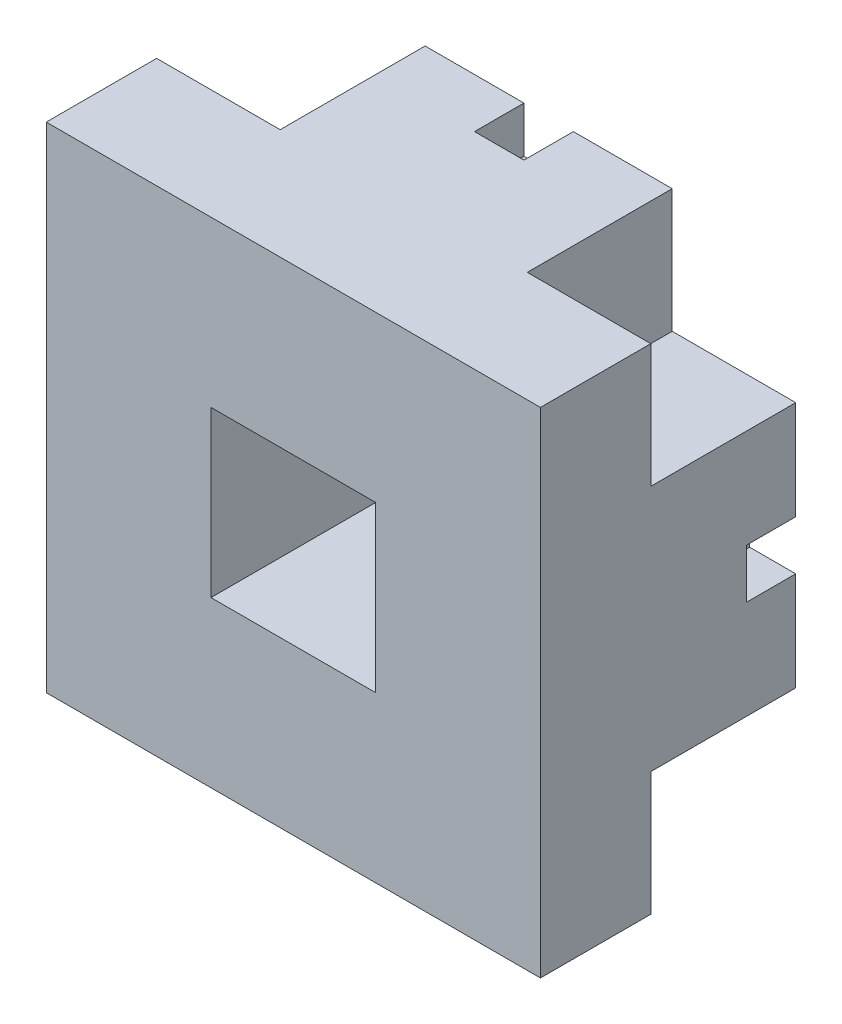
ISO-10303-21;
HEADER;
FILE_DESCRIPTION(('STEP AP214'),'2;1');
FILE_NAME('part.step','',(''),(''),'','','');
FILE_SCHEMA(('AUTOMOTIVE_DESIGN { 1 0 10303 214 1 1 1 1 }'));
ENDSEC;
DATA;
#1=APPLICATION_CONTEXT('core data for automotive mechanical design processes');
#2=APPLICATION_PROTOCOL_DEFINITION('international standard','automotive_design',2000,#1);
#3=PRODUCT_CONTEXT('',#1,'mechanical');
#4=PRODUCT('Part','Part','',(#3));
#5=PRODUCT_RELATED_PRODUCT_CATEGORY('part','',(#4));
#6=PRODUCT_DEFINITION_FORMATION('','',#4);
#7=PRODUCT_DEFINITION_CONTEXT('part definition',#1,'design');
#8=PRODUCT_DEFINITION('design','',#6,#7);
#9=PRODUCT_DEFINITION_SHAPE('','',#8);
#10=(LENGTH_UNIT() NAMED_UNIT(*) SI_UNIT(.MILLI.,.METRE.));
#11=(NAMED_UNIT(*) PLANE_ANGLE_UNIT() SI_UNIT($,.RADIAN.));
#12=(NAMED_UNIT(*) SI_UNIT($,.STERADIAN.) SOLID_ANGLE_UNIT());
#13=UNCERTAINTY_MEASURE_WITH_UNIT(LENGTH_MEASURE(1.E-05),#10,'distance_accuracy_value','');
#14=(GEOMETRIC_REPRESENTATION_CONTEXT(3) GLOBAL_UNCERTAINTY_ASSIGNED_CONTEXT((#13)) GLOBAL_UNIT_ASSIGNED_CONTEXT((#10,
#11,#12)) REPRESENTATION_CONTEXT('',''));
#15=CARTESIAN_POINT('',(0.,0.,0.));
#16=DIRECTION('',(0.,0.,1.));
#17=DIRECTION('',(1.,0.,0.));
#18=AXIS2_PLACEMENT_3D('',#15,#16,#17);
#19=CARTESIAN_POINT('',(0.,0.,0.));
#20=DIRECTION('',(0.,0.,1.));
#21=DIRECTION('',(1.,0.,0.));
#22=AXIS2_PLACEMENT_3D('',#19,#20,#21);
#23=PLANE('',#22);
#24=DIRECTION('',(0.,1.,0.));
#25=VECTOR('',#24,1.);
#26=CARTESIAN_POINT('',(-500.,-250.,0.));
#27=LINE('',#26,#25);
#28=CARTESIAN_POINT('',(-500.,-500.,0.));
#29=VERTEX_POINT('',#28);
#30=CARTESIAN_POINT('',(-500.,500.,0.));
#31=VERTEX_POINT('',#30);
#32=EDGE_CURVE('E666',#29,#31,#27,.T.);
#33=ORIENTED_EDGE('',*,*,#32,.T.);
#34=DIRECTION('',(1.,0.,0.));
#35=VECTOR('',#34,1.);
#36=CARTESIAN_POINT('',(-250.,500.,0.));
#37=LINE('',#36,#35);
#38=CARTESIAN_POINT('',(500.,500.,0.));
#39=VERTEX_POINT('',#38);
#40=EDGE_CURVE('E27',#31,#39,#37,.T.);
#41=ORIENTED_EDGE('',*,*,#40,.T.);
#42=DIRECTION('',(0.,-1.,0.));
#43=VECTOR('',#42,1.);
#44=CARTESIAN_POINT('',(500.,250.,0.));
#45=LINE('',#44,#43);
#46=CARTESIAN_POINT('',(500.,-500.,0.));
#47=VERTEX_POINT('',#46);
#48=EDGE_CURVE('E557',#39,#47,#45,.T.);
#49=ORIENTED_EDGE('',*,*,#48,.T.);
#50=DIRECTION('',(-1.,0.,0.));
#51=VECTOR('',#50,1.);
#52=CARTESIAN_POINT('',(250.,-500.,0.));
#53=LINE('',#52,#51);
#54=EDGE_CURVE('E515',#47,#29,#53,.T.);
#55=ORIENTED_EDGE('',*,*,#54,.T.);
#56=EDGE_LOOP('',(#33,#41,#49,#55));
#57=FACE_BOUND('',#56,.T.);
#58=DIRECTION('',(1.,0.,0.));
#59=VECTOR('',#58,1.);
#60=CARTESIAN_POINT('',(-1500.,1500.,0.));
#61=LINE('',#60,#59);
#62=CARTESIAN_POINT('',(-1500.,1500.,0.));
#63=VERTEX_POINT('',#62);
#64=CARTESIAN_POINT('',(1500.,1500.,0.));
#65=VERTEX_POINT('',#64);
#66=EDGE_CURVE('E586',#63,#65,#61,.T.);
#67=ORIENTED_EDGE('',*,*,#66,.F.);
#68=DIRECTION('',(0.,1.,0.));
#69=VECTOR('',#68,1.);
#70=CARTESIAN_POINT('',(-1500.,-1500.,0.));
#71=LINE('',#70,#69);
#72=CARTESIAN_POINT('',(-1500.,-1500.,0.));
#73=VERTEX_POINT('',#72);
#74=EDGE_CURVE('E641',#73,#63,#71,.T.);
#75=ORIENTED_EDGE('',*,*,#74,.F.);
#76=DIRECTION('',(-1.,0.,0.));
#77=VECTOR('',#76,1.);
#78=CARTESIAN_POINT('',(1500.,-1500.,0.));
#79=LINE('',#78,#77);
#80=CARTESIAN_POINT('',(1500.,-1500.,0.));
#81=VERTEX_POINT('',#80);
#82=EDGE_CURVE('E560',#81,#73,#79,.T.);
#83=ORIENTED_EDGE('',*,*,#82,.F.);
#84=DIRECTION('',(0.,-1.,0.));
#85=VECTOR('',#84,1.);
#86=CARTESIAN_POINT('',(1500.,1500.,0.));
#87=LINE('',#86,#85);
#88=EDGE_CURVE('E11',#65,#81,#87,.T.);
#89=ORIENTED_EDGE('',*,*,#88,.F.);
#90=EDGE_LOOP('',(#67,#75,#83,#89));
#91=FACE_BOUND('',#90,.T.);
#92=ADVANCED_FACE('F16',(#57,#91),#23,.T.);
#93=CARTESIAN_POINT('',(1500.,1500.,0.));
#94=DIRECTION('',(1.,0.,0.));
#95=DIRECTION('',(0.,1.,0.));
#96=AXIS2_PLACEMENT_3D('',#93,#94,#95);
#97=PLANE('',#96);
#98=DIRECTION('',(0.,0.,-1.));
#99=VECTOR('',#98,1.);
#100=CARTESIAN_POINT('',(1500.,150.,-775.));
#101=LINE('',#100,#99);
#102=CARTESIAN_POINT('',(1500.,150.,-1250.));
#103=VERTEX_POINT('',#102);
#104=CARTESIAN_POINT('',(1500.,150.,-1550.));
#105=VERTEX_POINT('',#104);
#106=EDGE_CURVE('E539',#103,#105,#101,.T.);
#107=ORIENTED_EDGE('',*,*,#106,.T.);
#108=DIRECTION('',(0.,-1.,0.));
#109=VECTOR('',#108,1.);
#110=CARTESIAN_POINT('',(1500.,1500.,-1550.));
#111=LINE('',#110,#109);
#112=CARTESIAN_POINT('',(1500.,750.,-1550.));
#113=VERTEX_POINT('',#112);
#114=EDGE_CURVE('E573',#113,#105,#111,.T.);
#115=ORIENTED_EDGE('',*,*,#114,.F.);
#116=DIRECTION('',(0.,0.,1.));
#117=VECTOR('',#116,1.);
#118=CARTESIAN_POINT('',(1500.,750.,-775.));
#119=LINE('',#118,#117);
#120=CARTESIAN_POINT('',(1500.,750.,-670.));
#121=VERTEX_POINT('',#120);
#122=EDGE_CURVE('E504',#113,#121,#119,.T.);
#123=ORIENTED_EDGE('',*,*,#122,.T.);
#124=DIRECTION('',(0.,1.,0.));
#125=VECTOR('',#124,1.);
#126=CARTESIAN_POINT('',(1500.,1312.5,-670.));
#127=LINE('',#126,#125);
#128=CARTESIAN_POINT('',(1500.,1500.,-670.));
#129=VERTEX_POINT('',#128);
#130=EDGE_CURVE('E445',#121,#129,#127,.T.);
#131=ORIENTED_EDGE('',*,*,#130,.T.);
#132=DIRECTION('',(0.,0.,-1.));
#133=VECTOR('',#132,1.);
#134=CARTESIAN_POINT('',(1500.,1500.,0.));
#135=LINE('',#134,#133);
#136=EDGE_CURVE('E678',#65,#129,#135,.T.);
#137=ORIENTED_EDGE('',*,*,#136,.F.);
#138=ORIENTED_EDGE('',*,*,#88,.T.);
#139=DIRECTION('',(0.,0.,-1.));
#140=VECTOR('',#139,1.);
#141=CARTESIAN_POINT('',(1500.,-1500.,0.));
#142=LINE('',#141,#140);
#143=CARTESIAN_POINT('',(1500.,-1500.,-670.));
#144=VERTEX_POINT('',#143);
#145=EDGE_CURVE('E564',#81,#144,#142,.T.);
#146=ORIENTED_EDGE('',*,*,#145,.T.);
#147=DIRECTION('',(0.,1.,0.));
#148=VECTOR('',#147,1.);
#149=CARTESIAN_POINT('',(1500.,187.5,-670.));
#150=LINE('',#149,#148);
#151=CARTESIAN_POINT('',(1500.,-750.,-670.));
#152=VERTEX_POINT('',#151);
#153=EDGE_CURVE('E231',#144,#152,#150,.T.);
#154=ORIENTED_EDGE('',*,*,#153,.T.);
#155=DIRECTION('',(0.,0.,-1.));
#156=VECTOR('',#155,1.);
#157=CARTESIAN_POINT('',(1500.,-750.,-775.));
#158=LINE('',#157,#156);
#159=CARTESIAN_POINT('',(1500.,-750.,-1550.));
#160=VERTEX_POINT('',#159);
#161=EDGE_CURVE('E487',#152,#160,#158,.T.);
#162=ORIENTED_EDGE('',*,*,#161,.T.);
#163=DIRECTION('',(0.,-1.,0.));
#164=VECTOR('',#163,1.);
#165=CARTESIAN_POINT('',(1500.,1500.,-1550.));
#166=LINE('',#165,#164);
#167=CARTESIAN_POINT('',(1500.,-150.,-1550.));
#168=VERTEX_POINT('',#167);
#169=EDGE_CURVE('E570',#168,#160,#166,.T.);
#170=ORIENTED_EDGE('',*,*,#169,.F.);
#171=DIRECTION('',(0.,0.,1.));
#172=VECTOR('',#171,1.);
#173=CARTESIAN_POINT('',(1500.,-150.,-775.));
#174=LINE('',#173,#172);
#175=CARTESIAN_POINT('',(1500.,-150.,-1250.));
#176=VERTEX_POINT('',#175);
#177=EDGE_CURVE('E621',#168,#176,#174,.T.);
#178=ORIENTED_EDGE('',*,*,#177,.T.);
#179=DIRECTION('',(0.,1.,0.));
#180=VECTOR('',#179,1.);
#181=CARTESIAN_POINT('',(1500.,750.,-1250.));
#182=LINE('',#181,#180);
#183=EDGE_CURVE('E288',#176,#103,#182,.T.);
#184=ORIENTED_EDGE('',*,*,#183,.T.);
#185=EDGE_LOOP('',(#107,#115,#123,#131,#137,#138,#146,#154,#162,#170,#178,#184));
#186=FACE_BOUND('',#185,.T.);
#187=ADVANCED_FACE('F730',(#186),#97,.T.);
#188=CARTESIAN_POINT('',(-500.,500.,0.));
#189=DIRECTION('',(0.,1.,0.));
#190=DIRECTION('',(1.,0.,0.));
#191=AXIS2_PLACEMENT_3D('',#188,#189,#190);
#192=PLANE('',#191);
#193=ORIENTED_EDGE('',*,*,#40,.F.);
#194=DIRECTION('',(0.,0.,-1.));
#195=VECTOR('',#194,1.);
#196=CARTESIAN_POINT('',(-500.,500.,0.));
#197=LINE('',#196,#195);
#198=CARTESIAN_POINT('',(-500.,500.,-1550.));
#199=VERTEX_POINT('',#198);
#200=EDGE_CURVE('E519',#31,#199,#197,.T.);
#201=ORIENTED_EDGE('',*,*,#200,.T.);
#202=DIRECTION('',(-1.,0.,0.));
#203=VECTOR('',#202,1.);
#204=CARTESIAN_POINT('',(-250.,500.,-1550.));
#205=LINE('',#204,#203);
#206=CARTESIAN_POINT('',(500.,500.,-1550.));
#207=VERTEX_POINT('',#206);
#208=EDGE_CURVE('E437',#207,#199,#205,.T.);
#209=ORIENTED_EDGE('',*,*,#208,.F.);
#210=DIRECTION('',(0.,0.,-1.));
#211=VECTOR('',#210,1.);
#212=CARTESIAN_POINT('',(500.,500.,0.));
#213=LINE('',#212,#211);
#214=EDGE_CURVE('E602',#39,#207,#213,.T.);
#215=ORIENTED_EDGE('',*,*,#214,.F.);
#216=EDGE_LOOP('',(#193,#201,#209,#215));
#217=FACE_BOUND('',#216,.T.);
#218=ADVANCED_FACE('F1016',(#217),#192,.F.);
#219=CARTESIAN_POINT('',(500.,500.,0.));
#220=DIRECTION('',(1.,0.,0.));
#221=DIRECTION('',(0.,1.,0.));
#222=AXIS2_PLACEMENT_3D('',#219,#220,#221);
#223=PLANE('',#222);
#224=ORIENTED_EDGE('',*,*,#48,.F.);
#225=ORIENTED_EDGE('',*,*,#214,.T.);
#226=DIRECTION('',(0.,1.,0.));
#227=VECTOR('',#226,1.);
#228=CARTESIAN_POINT('',(500.,250.,-1550.));
#229=LINE('',#228,#227);
#230=CARTESIAN_POINT('',(500.,-500.,-1550.));
#231=VERTEX_POINT('',#230);
#232=EDGE_CURVE('E433',#231,#207,#229,.T.);
#233=ORIENTED_EDGE('',*,*,#232,.F.);
#234=DIRECTION('',(0.,0.,-1.));
#235=VECTOR('',#234,1.);
#236=CARTESIAN_POINT('',(500.,-500.,0.));
#237=LINE('',#236,#235);
#238=EDGE_CURVE('E518',#47,#231,#237,.T.);
#239=ORIENTED_EDGE('',*,*,#238,.F.);
#240=EDGE_LOOP('',(#224,#225,#233,#239));
#241=FACE_BOUND('',#240,.T.);
#242=ADVANCED_FACE('F1021',(#241),#223,.F.);
#243=CARTESIAN_POINT('',(500.,-500.,0.));
#244=DIRECTION('',(0.,-1.,0.));
#245=DIRECTION('',(0.,0.,-1.));
#246=AXIS2_PLACEMENT_3D('',#243,#244,#245);
#247=PLANE('',#246);
#248=ORIENTED_EDGE('',*,*,#54,.F.);
#249=ORIENTED_EDGE('',*,*,#238,.T.);
#250=DIRECTION('',(1.,0.,0.));
#251=VECTOR('',#250,1.);
#252=CARTESIAN_POINT('',(250.,-500.,-1550.));
#253=LINE('',#252,#251);
#254=CARTESIAN_POINT('',(-500.,-500.,-1550.));
#255=VERTEX_POINT('',#254);
#256=EDGE_CURVE('E438',#255,#231,#253,.T.);
#257=ORIENTED_EDGE('',*,*,#256,.F.);
#258=DIRECTION('',(0.,0.,-1.));
#259=VECTOR('',#258,1.);
#260=CARTESIAN_POINT('',(-500.,-500.,0.));
#261=LINE('',#260,#259);
#262=EDGE_CURVE('E663',#29,#255,#261,.T.);
#263=ORIENTED_EDGE('',*,*,#262,.F.);
#264=EDGE_LOOP('',(#248,#249,#257,#263));
#265=FACE_BOUND('',#264,.T.);
#266=ADVANCED_FACE('F961',(#265),#247,.F.);
#267=CARTESIAN_POINT('',(-500.,-500.,0.));
#268=DIRECTION('',(-1.,0.,0.));
#269=DIRECTION('',(0.,0.,1.));
#270=AXIS2_PLACEMENT_3D('',#267,#268,#269);
#271=PLANE('',#270);
#272=ORIENTED_EDGE('',*,*,#32,.F.);
#273=ORIENTED_EDGE('',*,*,#262,.T.);
#274=DIRECTION('',(0.,-1.,0.));
#275=VECTOR('',#274,1.);
#276=CARTESIAN_POINT('',(-500.,-250.,-1550.));
#277=LINE('',#276,#275);
#278=EDGE_CURVE('E390',#199,#255,#277,.T.);
#279=ORIENTED_EDGE('',*,*,#278,.F.);
#280=ORIENTED_EDGE('',*,*,#200,.F.);
#281=EDGE_LOOP('',(#272,#273,#279,#280));
#282=FACE_BOUND('',#281,.T.);
#283=ADVANCED_FACE('F898',(#282),#271,.F.);
#284=CARTESIAN_POINT('',(-1500.,1500.,0.));
#285=DIRECTION('',(0.,1.,0.));
#286=DIRECTION('',(1.,0.,0.));
#287=AXIS2_PLACEMENT_3D('',#284,#285,#286);
#288=PLANE('',#287);
#289=DIRECTION('',(0.,0.,-1.));
#290=VECTOR('',#289,1.);
#291=CARTESIAN_POINT('',(-150.,1500.,-775.));
#292=LINE('',#291,#290);
#293=CARTESIAN_POINT('',(-150.,1500.,-1250.));
#294=VERTEX_POINT('',#293);
#295=CARTESIAN_POINT('',(-150.,1500.,-1550.));
#296=VERTEX_POINT('',#295);
#297=EDGE_CURVE('E527',#294,#296,#292,.T.);
#298=ORIENTED_EDGE('',*,*,#297,.T.);
#299=DIRECTION('',(1.,0.,0.));
#300=VECTOR('',#299,1.);
#301=CARTESIAN_POINT('',(-1500.,1500.,-1550.));
#302=LINE('',#301,#300);
#303=CARTESIAN_POINT('',(-750.,1500.,-1550.));
#304=VERTEX_POINT('',#303);
#305=EDGE_CURVE('E449',#304,#296,#302,.T.);
#306=ORIENTED_EDGE('',*,*,#305,.F.);
#307=DIRECTION('',(0.,0.,1.));
#308=VECTOR('',#307,1.);
#309=CARTESIAN_POINT('',(-750.,1500.,-775.));
#310=LINE('',#309,#308);
#311=CARTESIAN_POINT('',(-750.,1500.,-670.));
#312=VERTEX_POINT('',#311);
#313=EDGE_CURVE('E524',#304,#312,#310,.T.);
#314=ORIENTED_EDGE('',*,*,#313,.T.);
#315=DIRECTION('',(-1.,0.,0.));
#316=VECTOR('',#315,1.);
#317=CARTESIAN_POINT('',(-1312.5,1500.,-670.));
#318=LINE('',#317,#316);
#319=CARTESIAN_POINT('',(-1500.,1500.,-670.));
#320=VERTEX_POINT('',#319);
#321=EDGE_CURVE('E425',#312,#320,#318,.T.);
#322=ORIENTED_EDGE('',*,*,#321,.T.);
#323=DIRECTION('',(0.,0.,-1.));
#324=VECTOR('',#323,1.);
#325=CARTESIAN_POINT('',(-1500.,1500.,0.));
#326=LINE('',#325,#324);
#327=EDGE_CURVE('E20',#63,#320,#326,.T.);
#328=ORIENTED_EDGE('',*,*,#327,.F.);
#329=ORIENTED_EDGE('',*,*,#66,.T.);
#330=ORIENTED_EDGE('',*,*,#136,.T.);
#331=DIRECTION('',(-1.,0.,0.));
#332=VECTOR('',#331,1.);
#333=CARTESIAN_POINT('',(-187.5,1500.,-670.));
#334=LINE('',#333,#332);
#335=CARTESIAN_POINT('',(750.,1500.,-670.));
#336=VERTEX_POINT('',#335);
#337=EDGE_CURVE('E450',#129,#336,#334,.T.);
#338=ORIENTED_EDGE('',*,*,#337,.T.);
#339=DIRECTION('',(0.,0.,-1.));
#340=VECTOR('',#339,1.);
#341=CARTESIAN_POINT('',(750.,1500.,-775.));
#342=LINE('',#341,#340);
#343=CARTESIAN_POINT('',(750.,1500.,-1550.));
#344=VERTEX_POINT('',#343);
#345=EDGE_CURVE('E543',#336,#344,#342,.T.);
#346=ORIENTED_EDGE('',*,*,#345,.T.);
#347=DIRECTION('',(1.,0.,0.));
#348=VECTOR('',#347,1.);
#349=CARTESIAN_POINT('',(-1500.,1500.,-1550.));
#350=LINE('',#349,#348);
#351=CARTESIAN_POINT('',(150.,1500.,-1550.));
#352=VERTEX_POINT('',#351);
#353=EDGE_CURVE('E630',#352,#344,#350,.T.);
#354=ORIENTED_EDGE('',*,*,#353,.F.);
#355=DIRECTION('',(0.,0.,1.));
#356=VECTOR('',#355,1.);
#357=CARTESIAN_POINT('',(150.,1500.,-775.));
#358=LINE('',#357,#356);
#359=CARTESIAN_POINT('',(150.,1500.,-1250.));
#360=VERTEX_POINT('',#359);
#361=EDGE_CURVE('E569',#352,#360,#358,.T.);
#362=ORIENTED_EDGE('',*,*,#361,.T.);
#363=DIRECTION('',(-1.,0.,0.));
#364=VECTOR('',#363,1.);
#365=CARTESIAN_POINT('',(-750.,1500.,-1250.));
#366=LINE('',#365,#364);
#367=EDGE_CURVE('E439',#360,#294,#366,.T.);
#368=ORIENTED_EDGE('',*,*,#367,.T.);
#369=EDGE_LOOP('',(#298,#306,#314,#322,#328,#329,#330,#338,#346,#354,#362,#368));
#370=FACE_BOUND('',#369,.T.);
#371=ADVANCED_FACE('F788',(#370),#288,.T.);
#372=CARTESIAN_POINT('',(0.,0.,-1550.));
#373=DIRECTION('',(0.,0.,-1.));
#374=DIRECTION('',(0.,-1.,0.));
#375=AXIS2_PLACEMENT_3D('',#372,#373,#374);
#376=PLANE('',#375);
#377=ORIENTED_EDGE('',*,*,#278,.T.);
#378=ORIENTED_EDGE('',*,*,#256,.T.);
#379=ORIENTED_EDGE('',*,*,#232,.T.);
#380=ORIENTED_EDGE('',*,*,#208,.T.);
#381=EDGE_LOOP('',(#377,#378,#379,#380));
#382=FACE_BOUND('',#381,.T.);
#383=DIRECTION('',(-1.,0.,0.));
#384=VECTOR('',#383,1.);
#385=CARTESIAN_POINT('',(-610.,150.,-1550.));
#386=LINE('',#385,#384);
#387=CARTESIAN_POINT('',(-1220.,150.,-1550.));
#388=VERTEX_POINT('',#387);
#389=CARTESIAN_POINT('',(-1500.,150.,-1550.));
#390=VERTEX_POINT('',#389);
#391=EDGE_CURVE('E535',#388,#390,#386,.T.);
#392=ORIENTED_EDGE('',*,*,#391,.T.);
#393=DIRECTION('',(0.,1.,0.));
#394=VECTOR('',#393,1.);
#395=CARTESIAN_POINT('',(-1500.,-1500.,-1550.));
#396=LINE('',#395,#394);
#397=CARTESIAN_POINT('',(-1500.,750.,-1550.));
#398=VERTEX_POINT('',#397);
#399=EDGE_CURVE('E396',#390,#398,#396,.T.);
#400=ORIENTED_EDGE('',*,*,#399,.T.);
#401=DIRECTION('',(1.,0.,0.));
#402=VECTOR('',#401,1.);
#403=CARTESIAN_POINT('',(-750.,750.,-1550.));
#404=LINE('',#403,#402);
#405=CARTESIAN_POINT('',(-750.,750.,-1550.));
#406=VERTEX_POINT('',#405);
#407=EDGE_CURVE('E520',#398,#406,#404,.T.);
#408=ORIENTED_EDGE('',*,*,#407,.T.);
#409=DIRECTION('',(0.,1.,0.));
#410=VECTOR('',#409,1.);
#411=CARTESIAN_POINT('',(-750.,375.,-1550.));
#412=LINE('',#411,#410);
#413=EDGE_CURVE('E491',#406,#304,#412,.T.);
#414=ORIENTED_EDGE('',*,*,#413,.T.);
#415=ORIENTED_EDGE('',*,*,#305,.T.);
#416=DIRECTION('',(0.,-1.,0.));
#417=VECTOR('',#416,1.);
#418=CARTESIAN_POINT('',(-150.,750.,-1550.));
#419=LINE('',#418,#417);
#420=CARTESIAN_POINT('',(-150.,1220.,-1550.));
#421=VERTEX_POINT('',#420);
#422=EDGE_CURVE('E531',#296,#421,#419,.T.);
#423=ORIENTED_EDGE('',*,*,#422,.T.);
#424=DIRECTION('',(1.,0.,0.));
#425=VECTOR('',#424,1.);
#426=CARTESIAN_POINT('',(-75.,1220.,-1550.));
#427=LINE('',#426,#425);
#428=CARTESIAN_POINT('',(150.,1220.,-1550.));
#429=VERTEX_POINT('',#428);
#430=EDGE_CURVE('E432',#421,#429,#427,.T.);
#431=ORIENTED_EDGE('',*,*,#430,.T.);
#432=DIRECTION('',(0.,1.,0.));
#433=VECTOR('',#432,1.);
#434=CARTESIAN_POINT('',(150.,610.,-1550.));
#435=LINE('',#434,#433);
#436=EDGE_CURVE('E466',#429,#352,#435,.T.);
#437=ORIENTED_EDGE('',*,*,#436,.T.);
#438=ORIENTED_EDGE('',*,*,#353,.T.);
#439=DIRECTION('',(0.,-1.,0.));
#440=VECTOR('',#439,1.);
#441=CARTESIAN_POINT('',(750.,750.,-1550.));
#442=LINE('',#441,#440);
#443=CARTESIAN_POINT('',(750.,750.,-1550.));
#444=VERTEX_POINT('',#443);
#445=EDGE_CURVE('E508',#344,#444,#442,.T.);
#446=ORIENTED_EDGE('',*,*,#445,.T.);
#447=DIRECTION('',(1.,0.,0.));
#448=VECTOR('',#447,1.);
#449=CARTESIAN_POINT('',(375.,750.,-1550.));
#450=LINE('',#449,#448);
#451=EDGE_CURVE('E422',#444,#113,#450,.T.);
#452=ORIENTED_EDGE('',*,*,#451,.T.);
#453=ORIENTED_EDGE('',*,*,#114,.T.);
#454=DIRECTION('',(-1.,0.,0.));
#455=VECTOR('',#454,1.);
#456=CARTESIAN_POINT('',(750.,150.,-1550.));
#457=LINE('',#456,#455);
#458=CARTESIAN_POINT('',(1220.,150.,-1550.));
#459=VERTEX_POINT('',#458);
#460=EDGE_CURVE('E420',#105,#459,#457,.T.);
#461=ORIENTED_EDGE('',*,*,#460,.T.);
#462=DIRECTION('',(0.,-1.,0.));
#463=VECTOR('',#462,1.);
#464=CARTESIAN_POINT('',(1220.,75.,-1550.));
#465=LINE('',#464,#463);
#466=CARTESIAN_POINT('',(1220.,-150.,-1550.));
#467=VERTEX_POINT('',#466);
#468=EDGE_CURVE('E607',#459,#467,#465,.T.);
#469=ORIENTED_EDGE('',*,*,#468,.T.);
#470=DIRECTION('',(1.,0.,0.));
#471=VECTOR('',#470,1.);
#472=CARTESIAN_POINT('',(610.,-150.,-1550.));
#473=LINE('',#472,#471);
#474=EDGE_CURVE('E443',#467,#168,#473,.T.);
#475=ORIENTED_EDGE('',*,*,#474,.T.);
#476=ORIENTED_EDGE('',*,*,#169,.T.);
#477=DIRECTION('',(-1.,0.,0.));
#478=VECTOR('',#477,1.);
#479=CARTESIAN_POINT('',(750.,-750.,-1550.));
#480=LINE('',#479,#478);
#481=CARTESIAN_POINT('',(750.,-750.,-1550.));
#482=VERTEX_POINT('',#481);
#483=EDGE_CURVE('E266',#160,#482,#480,.T.);
#484=ORIENTED_EDGE('',*,*,#483,.T.);
#485=DIRECTION('',(0.,-1.,0.));
#486=VECTOR('',#485,1.);
#487=CARTESIAN_POINT('',(750.,-375.,-1550.));
#488=LINE('',#487,#486);
#489=CARTESIAN_POINT('',(750.,-1500.,-1550.));
#490=VERTEX_POINT('',#489);
#491=EDGE_CURVE('E511',#482,#490,#488,.T.);
#492=ORIENTED_EDGE('',*,*,#491,.T.);
#493=DIRECTION('',(-1.,0.,0.));
#494=VECTOR('',#493,1.);
#495=CARTESIAN_POINT('',(1500.,-1500.,-1550.));
#496=LINE('',#495,#494);
#497=CARTESIAN_POINT('',(150.,-1500.,-1550.));
#498=VERTEX_POINT('',#497);
#499=EDGE_CURVE('E477',#490,#498,#496,.T.);
#500=ORIENTED_EDGE('',*,*,#499,.T.);
#501=DIRECTION('',(0.,1.,0.));
#502=VECTOR('',#501,1.);
#503=CARTESIAN_POINT('',(150.,-750.,-1550.));
#504=LINE('',#503,#502);
#505=CARTESIAN_POINT('',(150.,-1220.,-1550.));
#506=VERTEX_POINT('',#505);
#507=EDGE_CURVE('E472',#498,#506,#504,.T.);
#508=ORIENTED_EDGE('',*,*,#507,.T.);
#509=DIRECTION('',(-1.,0.,0.));
#510=VECTOR('',#509,1.);
#511=CARTESIAN_POINT('',(75.,-1220.,-1550.));
#512=LINE('',#511,#510);
#513=CARTESIAN_POINT('',(-150.,-1220.,-1550.));
#514=VERTEX_POINT('',#513);
#515=EDGE_CURVE('E503',#506,#514,#512,.T.);
#516=ORIENTED_EDGE('',*,*,#515,.T.);
#517=DIRECTION('',(0.,-1.,0.));
#518=VECTOR('',#517,1.);
#519=CARTESIAN_POINT('',(-150.,-610.,-1550.));
#520=LINE('',#519,#518);
#521=CARTESIAN_POINT('',(-150.,-1500.,-1550.));
#522=VERTEX_POINT('',#521);
#523=EDGE_CURVE('E399',#514,#522,#520,.T.);
#524=ORIENTED_EDGE('',*,*,#523,.T.);
#525=DIRECTION('',(-1.,0.,0.));
#526=VECTOR('',#525,1.);
#527=CARTESIAN_POINT('',(1500.,-1500.,-1550.));
#528=LINE('',#527,#526);
#529=CARTESIAN_POINT('',(-750.,-1500.,-1550.));
#530=VERTEX_POINT('',#529);
#531=EDGE_CURVE('E514',#522,#530,#528,.T.);
#532=ORIENTED_EDGE('',*,*,#531,.T.);
#533=DIRECTION('',(0.,1.,0.));
#534=VECTOR('',#533,1.);
#535=CARTESIAN_POINT('',(-750.,-750.,-1550.));
#536=LINE('',#535,#534);
#537=CARTESIAN_POINT('',(-750.,-750.,-1550.));
#538=VERTEX_POINT('',#537);
#539=EDGE_CURVE('E357',#530,#538,#536,.T.);
#540=ORIENTED_EDGE('',*,*,#539,.T.);
#541=DIRECTION('',(-1.,0.,0.));
#542=VECTOR('',#541,1.);
#543=CARTESIAN_POINT('',(-375.,-750.,-1550.));
#544=LINE('',#543,#542);
#545=CARTESIAN_POINT('',(-1500.,-750.,-1550.));
#546=VERTEX_POINT('',#545);
#547=EDGE_CURVE('E349',#538,#546,#544,.T.);
#548=ORIENTED_EDGE('',*,*,#547,.T.);
#549=DIRECTION('',(0.,1.,0.));
#550=VECTOR('',#549,1.);
#551=CARTESIAN_POINT('',(-1500.,-1500.,-1550.));
#552=LINE('',#551,#550);
#553=CARTESIAN_POINT('',(-1500.,-150.,-1550.));
#554=VERTEX_POINT('',#553);
#555=EDGE_CURVE('E354',#546,#554,#552,.T.);
#556=ORIENTED_EDGE('',*,*,#555,.T.);
#557=DIRECTION('',(1.,0.,0.));
#558=VECTOR('',#557,1.);
#559=CARTESIAN_POINT('',(-750.,-150.,-1550.));
#560=LINE('',#559,#558);
#561=CARTESIAN_POINT('',(-1220.,-150.,-1550.));
#562=VERTEX_POINT('',#561);
#563=EDGE_CURVE('E610',#554,#562,#560,.T.);
#564=ORIENTED_EDGE('',*,*,#563,.T.);
#565=DIRECTION('',(0.,1.,0.));
#566=VECTOR('',#565,1.);
#567=CARTESIAN_POINT('',(-1220.,-75.,-1550.));
#568=LINE('',#567,#566);
#569=EDGE_CURVE('E395',#562,#388,#568,.T.);
#570=ORIENTED_EDGE('',*,*,#569,.T.);
#571=EDGE_LOOP('',(#392,#400,#408,#414,#415,#423,#431,#437,#438,#446,#452,#453,#461,#469,#475,
#476,#484,#492,#500,#508,#516,#524,#532,#540,#548,#556,#564,#570));
#572=FACE_BOUND('',#571,.T.);
#573=ADVANCED_FACE('F352',(#382,#572),#376,.T.);
#574=CARTESIAN_POINT('',(1125.,1125.,-670.));
#575=DIRECTION('',(0.,0.,1.));
#576=DIRECTION('',(1.,0.,0.));
#577=AXIS2_PLACEMENT_3D('',#574,#575,#576);
#578=PLANE('',#577);
#579=ORIENTED_EDGE('',*,*,#337,.F.);
#580=ORIENTED_EDGE('',*,*,#130,.F.);
#581=DIRECTION('',(1.,0.,0.));
#582=VECTOR('',#581,1.);
#583=CARTESIAN_POINT('',(750.,750.,-670.));
#584=LINE('',#583,#582);
#585=CARTESIAN_POINT('',(750.,750.,-670.));
#586=VERTEX_POINT('',#585);
#587=EDGE_CURVE('E498',#586,#121,#584,.T.);
#588=ORIENTED_EDGE('',*,*,#587,.F.);
#589=DIRECTION('',(0.,-1.,0.));
#590=VECTOR('',#589,1.);
#591=CARTESIAN_POINT('',(750.,1500.,-670.));
#592=LINE('',#591,#590);
#593=EDGE_CURVE('E547',#336,#586,#592,.T.);
#594=ORIENTED_EDGE('',*,*,#593,.F.);
#595=EDGE_LOOP('',(#579,#580,#588,#594));
#596=FACE_BOUND('',#595,.T.);
#597=ADVANCED_FACE('F951',(#596),#578,.F.);
#598=CARTESIAN_POINT('',(750.,1500.,-1550.));
#599=DIRECTION('',(-1.,0.,0.));
#600=DIRECTION('',(0.,1.,0.));
#601=AXIS2_PLACEMENT_3D('',#598,#599,#600);
#602=PLANE('',#601);
#603=ORIENTED_EDGE('',*,*,#445,.F.);
#604=ORIENTED_EDGE('',*,*,#345,.F.);
#605=ORIENTED_EDGE('',*,*,#593,.T.);
#606=DIRECTION('',(0.,0.,1.));
#607=VECTOR('',#606,1.);
#608=CARTESIAN_POINT('',(750.,750.,-1550.));
#609=LINE('',#608,#607);
#610=EDGE_CURVE('E424',#444,#586,#609,.T.);
#611=ORIENTED_EDGE('',*,*,#610,.F.);
#612=EDGE_LOOP('',(#603,#604,#605,#611));
#613=FACE_BOUND('',#612,.T.);
#614=ADVANCED_FACE('F1002',(#613),#602,.F.);
#615=CARTESIAN_POINT('',(750.,750.,-1550.));
#616=DIRECTION('',(0.,-1.,0.));
#617=DIRECTION('',(0.,0.,-1.));
#618=AXIS2_PLACEMENT_3D('',#615,#616,#617);
#619=PLANE('',#618);
#620=ORIENTED_EDGE('',*,*,#451,.F.);
#621=ORIENTED_EDGE('',*,*,#610,.T.);
#622=ORIENTED_EDGE('',*,*,#587,.T.);
#623=ORIENTED_EDGE('',*,*,#122,.F.);
#624=EDGE_LOOP('',(#620,#621,#622,#623));
#625=FACE_BOUND('',#624,.T.);
#626=ADVANCED_FACE('F1032',(#625),#619,.F.);
#627=CARTESIAN_POINT('',(-1125.,1125.,-670.));
#628=DIRECTION('',(0.,0.,1.));
#629=DIRECTION('',(1.,0.,0.));
#630=AXIS2_PLACEMENT_3D('',#627,#628,#629);
#631=PLANE('',#630);
#632=ORIENTED_EDGE('',*,*,#321,.F.);
#633=DIRECTION('',(0.,1.,0.));
#634=VECTOR('',#633,1.);
#635=CARTESIAN_POINT('',(-750.,1500.,-670.));
#636=LINE('',#635,#634);
#637=CARTESIAN_POINT('',(-750.,750.,-670.));
#638=VERTEX_POINT('',#637);
#639=EDGE_CURVE('E598',#638,#312,#636,.T.);
#640=ORIENTED_EDGE('',*,*,#639,.F.);
#641=DIRECTION('',(1.,0.,0.));
#642=VECTOR('',#641,1.);
#643=CARTESIAN_POINT('',(-750.,750.,-670.));
#644=LINE('',#643,#642);
#645=CARTESIAN_POINT('',(-1500.,750.,-670.));
#646=VERTEX_POINT('',#645);
#647=EDGE_CURVE('E523',#646,#638,#644,.T.);
#648=ORIENTED_EDGE('',*,*,#647,.F.);
#649=DIRECTION('',(0.,-1.,0.));
#650=VECTOR('',#649,1.);
#651=CARTESIAN_POINT('',(-1500.,-187.5,-670.));
#652=LINE('',#651,#650);
#653=EDGE_CURVE('E409',#320,#646,#652,.T.);
#654=ORIENTED_EDGE('',*,*,#653,.F.);
#655=EDGE_LOOP('',(#632,#640,#648,#654));
#656=FACE_BOUND('',#655,.T.);
#657=ADVANCED_FACE('F916',(#656),#631,.F.);
#658=CARTESIAN_POINT('',(-1500.,750.,-1550.));
#659=DIRECTION('',(0.,-1.,0.));
#660=DIRECTION('',(-1.,0.,0.));
#661=AXIS2_PLACEMENT_3D('',#658,#659,#660);
#662=PLANE('',#661);
#663=ORIENTED_EDGE('',*,*,#407,.F.);
#664=DIRECTION('',(0.,0.,-1.));
#665=VECTOR('',#664,1.);
#666=CARTESIAN_POINT('',(-1500.,750.,-775.));
#667=LINE('',#666,#665);
#668=EDGE_CURVE('E400',#646,#398,#667,.T.);
#669=ORIENTED_EDGE('',*,*,#668,.F.);
#670=ORIENTED_EDGE('',*,*,#647,.T.);
#671=DIRECTION('',(0.,0.,1.));
#672=VECTOR('',#671,1.);
#673=CARTESIAN_POINT('',(-750.,750.,-1550.));
#674=LINE('',#673,#672);
#675=EDGE_CURVE('E594',#406,#638,#674,.T.);
#676=ORIENTED_EDGE('',*,*,#675,.F.);
#677=EDGE_LOOP('',(#663,#669,#670,#676));
#678=FACE_BOUND('',#677,.T.);
#679=ADVANCED_FACE('F886',(#678),#662,.F.);
#680=CARTESIAN_POINT('',(-750.,750.,-1550.));
#681=DIRECTION('',(1.,0.,0.));
#682=DIRECTION('',(0.,-1.,0.));
#683=AXIS2_PLACEMENT_3D('',#680,#681,#682);
#684=PLANE('',#683);
#685=ORIENTED_EDGE('',*,*,#413,.F.);
#686=ORIENTED_EDGE('',*,*,#675,.T.);
#687=ORIENTED_EDGE('',*,*,#639,.T.);
#688=ORIENTED_EDGE('',*,*,#313,.F.);
#689=EDGE_LOOP('',(#685,#686,#687,#688));
#690=FACE_BOUND('',#689,.T.);
#691=ADVANCED_FACE('F881',(#690),#684,.F.);
#692=CARTESIAN_POINT('',(-1125.,-1125.,-670.));
#693=DIRECTION('',(0.,0.,1.));
#694=DIRECTION('',(1.,0.,0.));
#695=AXIS2_PLACEMENT_3D('',#692,#693,#694);
#696=PLANE('',#695);
#697=DIRECTION('',(0.,-1.,0.));
#698=VECTOR('',#697,1.);
#699=CARTESIAN_POINT('',(-1500.,-1312.5,-670.));
#700=LINE('',#699,#698);
#701=CARTESIAN_POINT('',(-1500.,-750.,-670.));
#702=VERTEX_POINT('',#701);
#703=CARTESIAN_POINT('',(-1500.,-1500.,-670.));
#704=VERTEX_POINT('',#703);
#705=EDGE_CURVE('E373',#702,#704,#700,.T.);
#706=ORIENTED_EDGE('',*,*,#705,.F.);
#707=DIRECTION('',(-1.,0.,0.));
#708=VECTOR('',#707,1.);
#709=CARTESIAN_POINT('',(-1500.,-750.,-670.));
#710=LINE('',#709,#708);
#711=CARTESIAN_POINT('',(-750.,-750.,-670.));
#712=VERTEX_POINT('',#711);
#713=EDGE_CURVE('E368',#712,#702,#710,.T.);
#714=ORIENTED_EDGE('',*,*,#713,.F.);
#715=DIRECTION('',(0.,1.,0.));
#716=VECTOR('',#715,1.);
#717=CARTESIAN_POINT('',(-750.,-750.,-670.));
#718=LINE('',#717,#716);
#719=CARTESIAN_POINT('',(-750.,-1500.,-670.));
#720=VERTEX_POINT('',#719);
#721=EDGE_CURVE('E488',#720,#712,#718,.T.);
#722=ORIENTED_EDGE('',*,*,#721,.F.);
#723=DIRECTION('',(1.,0.,0.));
#724=VECTOR('',#723,1.);
#725=CARTESIAN_POINT('',(187.5,-1500.,-670.));
#726=LINE('',#725,#724);
#727=EDGE_CURVE('E563',#704,#720,#726,.T.);
#728=ORIENTED_EDGE('',*,*,#727,.F.);
#729=EDGE_LOOP('',(#706,#714,#722,#728));
#730=FACE_BOUND('',#729,.T.);
#731=ADVANCED_FACE('F780',(#730),#696,.F.);
#732=CARTESIAN_POINT('',(-750.,-1500.,-1550.));
#733=DIRECTION('',(1.,0.,0.));
#734=DIRECTION('',(0.,1.,0.));
#735=AXIS2_PLACEMENT_3D('',#732,#733,#734);
#736=PLANE('',#735);
#737=ORIENTED_EDGE('',*,*,#539,.F.);
#738=DIRECTION('',(0.,0.,-1.));
#739=VECTOR('',#738,1.);
#740=CARTESIAN_POINT('',(-750.,-1500.,-775.));
#741=LINE('',#740,#739);
#742=EDGE_CURVE('E580',#720,#530,#741,.T.);
#743=ORIENTED_EDGE('',*,*,#742,.F.);
#744=ORIENTED_EDGE('',*,*,#721,.T.);
#745=DIRECTION('',(0.,0.,1.));
#746=VECTOR('',#745,1.);
#747=CARTESIAN_POINT('',(-750.,-750.,-1550.));
#748=LINE('',#747,#746);
#749=EDGE_CURVE('E362',#538,#712,#748,.T.);
#750=ORIENTED_EDGE('',*,*,#749,.F.);
#751=EDGE_LOOP('',(#737,#743,#744,#750));
#752=FACE_BOUND('',#751,.T.);
#753=ADVANCED_FACE('F778',(#752),#736,.F.);
#754=CARTESIAN_POINT('',(-750.,-750.,-1550.));
#755=DIRECTION('',(0.,1.,0.));
#756=DIRECTION('',(1.,0.,0.));
#757=AXIS2_PLACEMENT_3D('',#754,#755,#756);
#758=PLANE('',#757);
#759=ORIENTED_EDGE('',*,*,#547,.F.);
#760=ORIENTED_EDGE('',*,*,#749,.T.);
#761=ORIENTED_EDGE('',*,*,#713,.T.);
#762=DIRECTION('',(0.,0.,1.));
#763=VECTOR('',#762,1.);
#764=CARTESIAN_POINT('',(-1500.,-750.,-775.));
#765=LINE('',#764,#763);
#766=EDGE_CURVE('E365',#546,#702,#765,.T.);
#767=ORIENTED_EDGE('',*,*,#766,.F.);
#768=EDGE_LOOP('',(#759,#760,#761,#767));
#769=FACE_BOUND('',#768,.T.);
#770=ADVANCED_FACE('F366',(#769),#758,.F.);
#771=CARTESIAN_POINT('',(1125.,-1125.,-670.));
#772=DIRECTION('',(0.,0.,1.));
#773=DIRECTION('',(1.,0.,0.));
#774=AXIS2_PLACEMENT_3D('',#771,#772,#773);
#775=PLANE('',#774);
#776=DIRECTION('',(1.,0.,0.));
#777=VECTOR('',#776,1.);
#778=CARTESIAN_POINT('',(1312.5,-1500.,-670.));
#779=LINE('',#778,#777);
#780=CARTESIAN_POINT('',(750.,-1500.,-670.));
#781=VERTEX_POINT('',#780);
#782=EDGE_CURVE('E635',#781,#144,#779,.T.);
#783=ORIENTED_EDGE('',*,*,#782,.F.);
#784=DIRECTION('',(0.,-1.,0.));
#785=VECTOR('',#784,1.);
#786=CARTESIAN_POINT('',(750.,-1500.,-670.));
#787=LINE('',#786,#785);
#788=CARTESIAN_POINT('',(750.,-750.,-670.));
#789=VERTEX_POINT('',#788);
#790=EDGE_CURVE('E462',#789,#781,#787,.T.);
#791=ORIENTED_EDGE('',*,*,#790,.F.);
#792=DIRECTION('',(-1.,0.,0.));
#793=VECTOR('',#792,1.);
#794=CARTESIAN_POINT('',(750.,-750.,-670.));
#795=LINE('',#794,#793);
#796=EDGE_CURVE('E254',#152,#789,#795,.T.);
#797=ORIENTED_EDGE('',*,*,#796,.F.);
#798=ORIENTED_EDGE('',*,*,#153,.F.);
#799=EDGE_LOOP('',(#783,#791,#797,#798));
#800=FACE_BOUND('',#799,.T.);
#801=ADVANCED_FACE('F833',(#800),#775,.F.);
#802=CARTESIAN_POINT('',(1500.,-750.,-1550.));
#803=DIRECTION('',(0.,1.,0.));
#804=DIRECTION('',(1.,0.,0.));
#805=AXIS2_PLACEMENT_3D('',#802,#803,#804);
#806=PLANE('',#805);
#807=ORIENTED_EDGE('',*,*,#483,.F.);
#808=ORIENTED_EDGE('',*,*,#161,.F.);
#809=ORIENTED_EDGE('',*,*,#796,.T.);
#810=DIRECTION('',(0.,0.,1.));
#811=VECTOR('',#810,1.);
#812=CARTESIAN_POINT('',(750.,-750.,-1550.));
#813=LINE('',#812,#811);
#814=EDGE_CURVE('E465',#482,#789,#813,.T.);
#815=ORIENTED_EDGE('',*,*,#814,.F.);
#816=EDGE_LOOP('',(#807,#808,#809,#815));
#817=FACE_BOUND('',#816,.T.);
#818=ADVANCED_FACE('F753',(#817),#806,.F.);
#819=CARTESIAN_POINT('',(750.,-750.,-1550.));
#820=DIRECTION('',(-1.,0.,0.));
#821=DIRECTION('',(0.,0.,1.));
#822=AXIS2_PLACEMENT_3D('',#819,#820,#821);
#823=PLANE('',#822);
#824=ORIENTED_EDGE('',*,*,#491,.F.);
#825=ORIENTED_EDGE('',*,*,#814,.T.);
#826=ORIENTED_EDGE('',*,*,#790,.T.);
#827=DIRECTION('',(0.,0.,1.));
#828=VECTOR('',#827,1.);
#829=CARTESIAN_POINT('',(750.,-1500.,-775.));
#830=LINE('',#829,#828);
#831=EDGE_CURVE('E480',#490,#781,#830,.T.);
#832=ORIENTED_EDGE('',*,*,#831,.F.);
#833=EDGE_LOOP('',(#824,#825,#826,#832));
#834=FACE_BOUND('',#833,.T.);
#835=ADVANCED_FACE('F757',(#834),#823,.F.);
#836=CARTESIAN_POINT('',(1500.,-1500.,0.));
#837=DIRECTION('',(0.,-1.,0.));
#838=DIRECTION('',(0.,0.,-1.));
#839=AXIS2_PLACEMENT_3D('',#836,#837,#838);
#840=PLANE('',#839);
#841=DIRECTION('',(0.,0.,1.));
#842=VECTOR('',#841,1.);
#843=CARTESIAN_POINT('',(-150.,-1500.,-775.));
#844=LINE('',#843,#842);
#845=CARTESIAN_POINT('',(-150.,-1500.,-1250.));
#846=VERTEX_POINT('',#845);
#847=EDGE_CURVE('E455',#522,#846,#844,.T.);
#848=ORIENTED_EDGE('',*,*,#847,.T.);
#849=DIRECTION('',(1.,0.,0.));
#850=VECTOR('',#849,1.);
#851=CARTESIAN_POINT('',(750.,-1500.,-1250.));
#852=LINE('',#851,#850);
#853=CARTESIAN_POINT('',(150.,-1500.,-1250.));
#854=VERTEX_POINT('',#853);
#855=EDGE_CURVE('E481',#846,#854,#852,.T.);
#856=ORIENTED_EDGE('',*,*,#855,.T.);
#857=DIRECTION('',(0.,0.,-1.));
#858=VECTOR('',#857,1.);
#859=CARTESIAN_POINT('',(150.,-1500.,-775.));
#860=LINE('',#859,#858);
#861=EDGE_CURVE('E475',#854,#498,#860,.T.);
#862=ORIENTED_EDGE('',*,*,#861,.T.);
#863=ORIENTED_EDGE('',*,*,#499,.F.);
#864=ORIENTED_EDGE('',*,*,#831,.T.);
#865=ORIENTED_EDGE('',*,*,#782,.T.);
#866=ORIENTED_EDGE('',*,*,#145,.F.);
#867=ORIENTED_EDGE('',*,*,#82,.T.);
#868=DIRECTION('',(0.,0.,-1.));
#869=VECTOR('',#868,1.);
#870=CARTESIAN_POINT('',(-1500.,-1500.,0.));
#871=LINE('',#870,#869);
#872=EDGE_CURVE('E575',#73,#704,#871,.T.);
#873=ORIENTED_EDGE('',*,*,#872,.T.);
#874=ORIENTED_EDGE('',*,*,#727,.T.);
#875=ORIENTED_EDGE('',*,*,#742,.T.);
#876=ORIENTED_EDGE('',*,*,#531,.F.);
#877=EDGE_LOOP('',(#848,#856,#862,#863,#864,#865,#866,#867,#873,#874,#875,#876));
#878=FACE_BOUND('',#877,.T.);
#879=ADVANCED_FACE('F763',(#878),#840,.T.);
#880=CARTESIAN_POINT('',(0.,-1360.,-1250.));
#881=DIRECTION('',(0.,0.,1.));
#882=DIRECTION('',(1.,0.,0.));
#883=AXIS2_PLACEMENT_3D('',#880,#881,#882);
#884=PLANE('',#883);
#885=ORIENTED_EDGE('',*,*,#855,.F.);
#886=DIRECTION('',(0.,-1.,0.));
#887=VECTOR('',#886,1.);
#888=CARTESIAN_POINT('',(-150.,-1220.,-1250.));
#889=LINE('',#888,#887);
#890=CARTESIAN_POINT('',(-150.,-1220.,-1250.));
#891=VERTEX_POINT('',#890);
#892=EDGE_CURVE('E451',#891,#846,#889,.T.);
#893=ORIENTED_EDGE('',*,*,#892,.F.);
#894=DIRECTION('',(-1.,0.,0.));
#895=VECTOR('',#894,1.);
#896=CARTESIAN_POINT('',(150.,-1220.,-1250.));
#897=LINE('',#896,#895);
#898=CARTESIAN_POINT('',(150.,-1220.,-1250.));
#899=VERTEX_POINT('',#898);
#900=EDGE_CURVE('E476',#899,#891,#897,.T.);
#901=ORIENTED_EDGE('',*,*,#900,.F.);
#902=DIRECTION('',(0.,1.,0.));
#903=VECTOR('',#902,1.);
#904=CARTESIAN_POINT('',(150.,-1500.,-1250.));
#905=LINE('',#904,#903);
#906=EDGE_CURVE('E536',#854,#899,#905,.T.);
#907=ORIENTED_EDGE('',*,*,#906,.F.);
#908=EDGE_LOOP('',(#885,#893,#901,#907));
#909=FACE_BOUND('',#908,.T.);
#910=ADVANCED_FACE('F811',(#909),#884,.F.);
#911=CARTESIAN_POINT('',(150.,-1500.,-1550.));
#912=DIRECTION('',(1.,0.,0.));
#913=DIRECTION('',(0.,-1.,0.));
#914=AXIS2_PLACEMENT_3D('',#911,#912,#913);
#915=PLANE('',#914);
#916=ORIENTED_EDGE('',*,*,#507,.F.);
#917=ORIENTED_EDGE('',*,*,#861,.F.);
#918=ORIENTED_EDGE('',*,*,#906,.T.);
#919=DIRECTION('',(0.,0.,1.));
#920=VECTOR('',#919,1.);
#921=CARTESIAN_POINT('',(150.,-1220.,-1550.));
#922=LINE('',#921,#920);
#923=EDGE_CURVE('E499',#506,#899,#922,.T.);
#924=ORIENTED_EDGE('',*,*,#923,.F.);
#925=EDGE_LOOP('',(#916,#917,#918,#924));
#926=FACE_BOUND('',#925,.T.);
#927=ADVANCED_FACE('F766',(#926),#915,.F.);
#928=CARTESIAN_POINT('',(150.,-1220.,-1550.));
#929=DIRECTION('',(0.,1.,0.));
#930=DIRECTION('',(1.,0.,0.));
#931=AXIS2_PLACEMENT_3D('',#928,#929,#930);
#932=PLANE('',#931);
#933=ORIENTED_EDGE('',*,*,#515,.F.);
#934=ORIENTED_EDGE('',*,*,#923,.T.);
#935=ORIENTED_EDGE('',*,*,#900,.T.);
#936=DIRECTION('',(0.,0.,1.));
#937=VECTOR('',#936,1.);
#938=CARTESIAN_POINT('',(-150.,-1220.,-1550.));
#939=LINE('',#938,#937);
#940=EDGE_CURVE('E406',#514,#891,#939,.T.);
#941=ORIENTED_EDGE('',*,*,#940,.F.);
#942=EDGE_LOOP('',(#933,#934,#935,#941));
#943=FACE_BOUND('',#942,.T.);
#944=ADVANCED_FACE('F18',(#943),#932,.F.);
#945=CARTESIAN_POINT('',(-150.,-1220.,-1550.));
#946=DIRECTION('',(-1.,0.,0.));
#947=DIRECTION('',(0.,1.,0.));
#948=AXIS2_PLACEMENT_3D('',#945,#946,#947);
#949=PLANE('',#948);
#950=ORIENTED_EDGE('',*,*,#523,.F.);
#951=ORIENTED_EDGE('',*,*,#940,.T.);
#952=ORIENTED_EDGE('',*,*,#892,.T.);
#953=ORIENTED_EDGE('',*,*,#847,.F.);
#954=EDGE_LOOP('',(#950,#951,#952,#953));
#955=FACE_BOUND('',#954,.T.);
#956=ADVANCED_FACE('F774',(#955),#949,.F.);
#957=CARTESIAN_POINT('',(-1500.,-1500.,0.));
#958=DIRECTION('',(-1.,0.,0.));
#959=DIRECTION('',(0.,0.,1.));
#960=AXIS2_PLACEMENT_3D('',#957,#958,#959);
#961=PLANE('',#960);
#962=DIRECTION('',(0.,0.,1.));
#963=VECTOR('',#962,1.);
#964=CARTESIAN_POINT('',(-1500.,150.,-775.));
#965=LINE('',#964,#963);
#966=CARTESIAN_POINT('',(-1500.,150.,-1250.));
#967=VERTEX_POINT('',#966);
#968=EDGE_CURVE('E460',#390,#967,#965,.T.);
#969=ORIENTED_EDGE('',*,*,#968,.T.);
#970=DIRECTION('',(0.,-1.,0.));
#971=VECTOR('',#970,1.);
#972=CARTESIAN_POINT('',(-1500.,-750.,-1250.));
#973=LINE('',#972,#971);
#974=CARTESIAN_POINT('',(-1500.,-150.,-1250.));
#975=VERTEX_POINT('',#974);
#976=EDGE_CURVE('E471',#967,#975,#973,.T.);
#977=ORIENTED_EDGE('',*,*,#976,.T.);
#978=DIRECTION('',(0.,0.,-1.));
#979=VECTOR('',#978,1.);
#980=CARTESIAN_POINT('',(-1500.,-150.,-775.));
#981=LINE('',#980,#979);
#982=EDGE_CURVE('E378',#975,#554,#981,.T.);
#983=ORIENTED_EDGE('',*,*,#982,.T.);
#984=ORIENTED_EDGE('',*,*,#555,.F.);
#985=ORIENTED_EDGE('',*,*,#766,.T.);
#986=ORIENTED_EDGE('',*,*,#705,.T.);
#987=ORIENTED_EDGE('',*,*,#872,.F.);
#988=ORIENTED_EDGE('',*,*,#74,.T.);
#989=ORIENTED_EDGE('',*,*,#327,.T.);
#990=ORIENTED_EDGE('',*,*,#653,.T.);
#991=ORIENTED_EDGE('',*,*,#668,.T.);
#992=ORIENTED_EDGE('',*,*,#399,.F.);
#993=EDGE_LOOP('',(#969,#977,#983,#984,#985,#986,#987,#988,#989,#990,#991,#992));
#994=FACE_BOUND('',#993,.T.);
#995=ADVANCED_FACE('F376',(#994),#961,.T.);
#996=CARTESIAN_POINT('',(1360.,0.,-1250.));
#997=DIRECTION('',(0.,0.,1.));
#998=DIRECTION('',(1.,0.,0.));
#999=AXIS2_PLACEMENT_3D('',#996,#997,#998);
#1000=PLANE('',#999);
#1001=ORIENTED_EDGE('',*,*,#183,.F.);
#1002=DIRECTION('',(1.,0.,0.));
#1003=VECTOR('',#1002,1.);
#1004=CARTESIAN_POINT('',(1220.,-150.,-1250.));
#1005=LINE('',#1004,#1003);
#1006=CARTESIAN_POINT('',(1220.,-150.,-1250.));
#1007=VERTEX_POINT('',#1006);
#1008=EDGE_CURVE('E669',#1007,#176,#1005,.T.);
#1009=ORIENTED_EDGE('',*,*,#1008,.F.);
#1010=DIRECTION('',(0.,-1.,0.));
#1011=VECTOR('',#1010,1.);
#1012=CARTESIAN_POINT('',(1220.,150.,-1250.));
#1013=LINE('',#1012,#1011);
#1014=CARTESIAN_POINT('',(1220.,150.,-1250.));
#1015=VERTEX_POINT('',#1014);
#1016=EDGE_CURVE('E280',#1015,#1007,#1013,.T.);
#1017=ORIENTED_EDGE('',*,*,#1016,.F.);
#1018=DIRECTION('',(-1.,0.,0.));
#1019=VECTOR('',#1018,1.);
#1020=CARTESIAN_POINT('',(1500.,150.,-1250.));
#1021=LINE('',#1020,#1019);
#1022=EDGE_CURVE('E386',#103,#1015,#1021,.T.);
#1023=ORIENTED_EDGE('',*,*,#1022,.F.);
#1024=EDGE_LOOP('',(#1001,#1009,#1017,#1023));
#1025=FACE_BOUND('',#1024,.T.);
#1026=ADVANCED_FACE('F822',(#1025),#1000,.F.);
#1027=CARTESIAN_POINT('',(1500.,150.,-1550.));
#1028=DIRECTION('',(0.,1.,0.));
#1029=DIRECTION('',(1.,0.,0.));
#1030=AXIS2_PLACEMENT_3D('',#1027,#1028,#1029);
#1031=PLANE('',#1030);
#1032=ORIENTED_EDGE('',*,*,#460,.F.);
#1033=ORIENTED_EDGE('',*,*,#106,.F.);
#1034=ORIENTED_EDGE('',*,*,#1022,.T.);
#1035=DIRECTION('',(0.,0.,1.));
#1036=VECTOR('',#1035,1.);
#1037=CARTESIAN_POINT('',(1220.,150.,-1550.));
#1038=LINE('',#1037,#1036);
#1039=EDGE_CURVE('E484',#459,#1015,#1038,.T.);
#1040=ORIENTED_EDGE('',*,*,#1039,.F.);
#1041=EDGE_LOOP('',(#1032,#1033,#1034,#1040));
#1042=FACE_BOUND('',#1041,.T.);
#1043=ADVANCED_FACE('F732',(#1042),#1031,.F.);
#1044=CARTESIAN_POINT('',(1220.,150.,-1550.));
#1045=DIRECTION('',(-1.,0.,0.));
#1046=DIRECTION('',(0.,0.,1.));
#1047=AXIS2_PLACEMENT_3D('',#1044,#1045,#1046);
#1048=PLANE('',#1047);
#1049=ORIENTED_EDGE('',*,*,#468,.F.);
#1050=ORIENTED_EDGE('',*,*,#1039,.T.);
#1051=ORIENTED_EDGE('',*,*,#1016,.T.);
#1052=DIRECTION('',(0.,0.,1.));
#1053=VECTOR('',#1052,1.);
#1054=CARTESIAN_POINT('',(1220.,-150.,-1550.));
#1055=LINE('',#1054,#1053);
#1056=EDGE_CURVE('E677',#467,#1007,#1055,.T.);
#1057=ORIENTED_EDGE('',*,*,#1056,.F.);
#1058=EDGE_LOOP('',(#1049,#1050,#1051,#1057));
#1059=FACE_BOUND('',#1058,.T.);
#1060=ADVANCED_FACE('F752',(#1059),#1048,.F.);
#1061=CARTESIAN_POINT('',(1220.,-150.,-1550.));
#1062=DIRECTION('',(0.,-1.,0.));
#1063=DIRECTION('',(0.,0.,-1.));
#1064=AXIS2_PLACEMENT_3D('',#1061,#1062,#1063);
#1065=PLANE('',#1064);
#1066=ORIENTED_EDGE('',*,*,#474,.F.);
#1067=ORIENTED_EDGE('',*,*,#1056,.T.);
#1068=ORIENTED_EDGE('',*,*,#1008,.T.);
#1069=ORIENTED_EDGE('',*,*,#177,.F.);
#1070=EDGE_LOOP('',(#1066,#1067,#1068,#1069));
#1071=FACE_BOUND('',#1070,.T.);
#1072=ADVANCED_FACE('F750',(#1071),#1065,.F.);
#1073=CARTESIAN_POINT('',(1.6655196468404E-13,1360.,-1250.));
#1074=DIRECTION('',(0.,0.,1.));
#1075=DIRECTION('',(1.,0.,0.));
#1076=AXIS2_PLACEMENT_3D('',#1073,#1074,#1075);
#1077=PLANE('',#1076);
#1078=ORIENTED_EDGE('',*,*,#367,.F.);
#1079=DIRECTION('',(0.,1.,0.));
#1080=VECTOR('',#1079,1.);
#1081=CARTESIAN_POINT('',(150.,1220.,-1250.));
#1082=LINE('',#1081,#1080);
#1083=CARTESIAN_POINT('',(150.,1220.,-1250.));
#1084=VERTEX_POINT('',#1083);
#1085=EDGE_CURVE('E629',#1084,#360,#1082,.T.);
#1086=ORIENTED_EDGE('',*,*,#1085,.F.);
#1087=DIRECTION('',(1.,0.,0.));
#1088=VECTOR('',#1087,1.);
#1089=CARTESIAN_POINT('',(-150.,1220.,-1250.));
#1090=LINE('',#1089,#1088);
#1091=CARTESIAN_POINT('',(-150.,1220.,-1250.));
#1092=VERTEX_POINT('',#1091);
#1093=EDGE_CURVE('E431',#1092,#1084,#1090,.T.);
#1094=ORIENTED_EDGE('',*,*,#1093,.F.);
#1095=DIRECTION('',(0.,-1.,0.));
#1096=VECTOR('',#1095,1.);
#1097=CARTESIAN_POINT('',(-150.,1500.,-1250.));
#1098=LINE('',#1097,#1096);
#1099=EDGE_CURVE('E444',#294,#1092,#1098,.T.);
#1100=ORIENTED_EDGE('',*,*,#1099,.F.);
#1101=EDGE_LOOP('',(#1078,#1086,#1094,#1100));
#1102=FACE_BOUND('',#1101,.T.);
#1103=ADVANCED_FACE('F844',(#1102),#1077,.F.);
#1104=CARTESIAN_POINT('',(-150.,1500.,-1550.));
#1105=DIRECTION('',(-1.,0.,0.));
#1106=DIRECTION('',(0.,0.,1.));
#1107=AXIS2_PLACEMENT_3D('',#1104,#1105,#1106);
#1108=PLANE('',#1107);
#1109=ORIENTED_EDGE('',*,*,#422,.F.);
#1110=ORIENTED_EDGE('',*,*,#297,.F.);
#1111=ORIENTED_EDGE('',*,*,#1099,.T.);
#1112=DIRECTION('',(0.,0.,1.));
#1113=VECTOR('',#1112,1.);
#1114=CARTESIAN_POINT('',(-150.,1220.,-1550.));
#1115=LINE('',#1114,#1113);
#1116=EDGE_CURVE('E427',#421,#1092,#1115,.T.);
#1117=ORIENTED_EDGE('',*,*,#1116,.F.);
#1118=EDGE_LOOP('',(#1109,#1110,#1111,#1117));
#1119=FACE_BOUND('',#1118,.T.);
#1120=ADVANCED_FACE('F839',(#1119),#1108,.F.);
#1121=CARTESIAN_POINT('',(-150.,1220.,-1550.));
#1122=DIRECTION('',(0.,-1.,0.));
#1123=DIRECTION('',(-1.,0.,0.));
#1124=AXIS2_PLACEMENT_3D('',#1121,#1122,#1123);
#1125=PLANE('',#1124);
#1126=ORIENTED_EDGE('',*,*,#430,.F.);
#1127=ORIENTED_EDGE('',*,*,#1116,.T.);
#1128=ORIENTED_EDGE('',*,*,#1093,.T.);
#1129=DIRECTION('',(0.,0.,1.));
#1130=VECTOR('',#1129,1.);
#1131=CARTESIAN_POINT('',(150.,1220.,-1550.));
#1132=LINE('',#1131,#1130);
#1133=EDGE_CURVE('E470',#429,#1084,#1132,.T.);
#1134=ORIENTED_EDGE('',*,*,#1133,.F.);
#1135=EDGE_LOOP('',(#1126,#1127,#1128,#1134));
#1136=FACE_BOUND('',#1135,.T.);
#1137=ADVANCED_FACE('F798',(#1136),#1125,.F.);
#1138=CARTESIAN_POINT('',(150.,1220.,-1550.));
#1139=DIRECTION('',(1.,0.,0.));
#1140=DIRECTION('',(0.,1.,0.));
#1141=AXIS2_PLACEMENT_3D('',#1138,#1139,#1140);
#1142=PLANE('',#1141);
#1143=ORIENTED_EDGE('',*,*,#436,.F.);
#1144=ORIENTED_EDGE('',*,*,#1133,.T.);
#1145=ORIENTED_EDGE('',*,*,#1085,.T.);
#1146=ORIENTED_EDGE('',*,*,#361,.F.);
#1147=EDGE_LOOP('',(#1143,#1144,#1145,#1146));
#1148=FACE_BOUND('',#1147,.T.);
#1149=ADVANCED_FACE('F792',(#1148),#1142,.F.);
#1150=CARTESIAN_POINT('',(-1360.,2.4982794702606E-13,-1250.));
#1151=DIRECTION('',(0.,0.,1.));
#1152=DIRECTION('',(1.,0.,0.));
#1153=AXIS2_PLACEMENT_3D('',#1150,#1151,#1152);
#1154=PLANE('',#1153);
#1155=ORIENTED_EDGE('',*,*,#976,.F.);
#1156=DIRECTION('',(-1.,0.,0.));
#1157=VECTOR('',#1156,1.);
#1158=CARTESIAN_POINT('',(-1220.,150.,-1250.));
#1159=LINE('',#1158,#1157);
#1160=CARTESIAN_POINT('',(-1220.,150.,-1250.));
#1161=VERTEX_POINT('',#1160);
#1162=EDGE_CURVE('E456',#1161,#967,#1159,.T.);
#1163=ORIENTED_EDGE('',*,*,#1162,.F.);
#1164=DIRECTION('',(0.,1.,0.));
#1165=VECTOR('',#1164,1.);
#1166=CARTESIAN_POINT('',(-1220.,-150.,-1250.));
#1167=LINE('',#1166,#1165);
#1168=CARTESIAN_POINT('',(-1220.,-150.,-1250.));
#1169=VERTEX_POINT('',#1168);
#1170=EDGE_CURVE('E394',#1169,#1161,#1167,.T.);
#1171=ORIENTED_EDGE('',*,*,#1170,.F.);
#1172=DIRECTION('',(1.,0.,0.));
#1173=VECTOR('',#1172,1.);
#1174=CARTESIAN_POINT('',(-1500.,-150.,-1250.));
#1175=LINE('',#1174,#1173);
#1176=EDGE_CURVE('E599',#975,#1169,#1175,.T.);
#1177=ORIENTED_EDGE('',*,*,#1176,.F.);
#1178=EDGE_LOOP('',(#1155,#1163,#1171,#1177));
#1179=FACE_BOUND('',#1178,.T.);
#1180=ADVANCED_FACE('F797',(#1179),#1154,.F.);
#1181=CARTESIAN_POINT('',(-1500.,-150.,-1550.));
#1182=DIRECTION('',(0.,-1.,0.));
#1183=DIRECTION('',(-1.,0.,0.));
#1184=AXIS2_PLACEMENT_3D('',#1181,#1182,#1183);
#1185=PLANE('',#1184);
#1186=ORIENTED_EDGE('',*,*,#563,.F.);
#1187=ORIENTED_EDGE('',*,*,#982,.F.);
#1188=ORIENTED_EDGE('',*,*,#1176,.T.);
#1189=DIRECTION('',(0.,0.,1.));
#1190=VECTOR('',#1189,1.);
#1191=CARTESIAN_POINT('',(-1220.,-150.,-1550.));
#1192=LINE('',#1191,#1190);
#1193=EDGE_CURVE('E392',#562,#1169,#1192,.T.);
#1194=ORIENTED_EDGE('',*,*,#1193,.F.);
#1195=EDGE_LOOP('',(#1186,#1187,#1188,#1194));
#1196=FACE_BOUND('',#1195,.T.);
#1197=ADVANCED_FACE('F866',(#1196),#1185,.F.);
#1198=CARTESIAN_POINT('',(-1220.,-150.,-1550.));
#1199=DIRECTION('',(1.,0.,0.));
#1200=DIRECTION('',(0.,-1.,0.));
#1201=AXIS2_PLACEMENT_3D('',#1198,#1199,#1200);
#1202=PLANE('',#1201);
#1203=ORIENTED_EDGE('',*,*,#569,.F.);
#1204=ORIENTED_EDGE('',*,*,#1193,.T.);
#1205=ORIENTED_EDGE('',*,*,#1170,.T.);
#1206=DIRECTION('',(0.,0.,1.));
#1207=VECTOR('',#1206,1.);
#1208=CARTESIAN_POINT('',(-1220.,150.,-1550.));
#1209=LINE('',#1208,#1207);
#1210=EDGE_CURVE('E461',#388,#1161,#1209,.T.);
#1211=ORIENTED_EDGE('',*,*,#1210,.F.);
#1212=EDGE_LOOP('',(#1203,#1204,#1205,#1211));
#1213=FACE_BOUND('',#1212,.T.);
#1214=ADVANCED_FACE('F856',(#1213),#1202,.F.);
#1215=CARTESIAN_POINT('',(-1220.,150.,-1550.));
#1216=DIRECTION('',(0.,1.,0.));
#1217=DIRECTION('',(1.,0.,0.));
#1218=AXIS2_PLACEMENT_3D('',#1215,#1216,#1217);
#1219=PLANE('',#1218);
#1220=ORIENTED_EDGE('',*,*,#391,.F.);
#1221=ORIENTED_EDGE('',*,*,#1210,.T.);
#1222=ORIENTED_EDGE('',*,*,#1162,.T.);
#1223=ORIENTED_EDGE('',*,*,#968,.F.);
#1224=EDGE_LOOP('',(#1220,#1221,#1222,#1223));
#1225=FACE_BOUND('',#1224,.T.);
#1226=ADVANCED_FACE('F851',(#1225),#1219,.F.);
#1227=CLOSED_SHELL('',(#92,#187,#218,#242,#266,#283,#371,#573,#597,#614,#626,#657,#679,#691,
#731,#753,#770,#801,#818,#835,#879,#910,#927,#944,#956,#995,#1026,#1043,#1060,#1072,#1103,#1120,
#1137,#1149,#1180,#1197,#1214,#1226));
#1228=MANIFOLD_SOLID_BREP('B1',#1227);
#1229=ADVANCED_BREP_SHAPE_REPRESENTATION('',(#18,#1228),#14);
#1230=SHAPE_DEFINITION_REPRESENTATION(#9,#1229);
ENDSEC;
END-ISO-10303-21;
